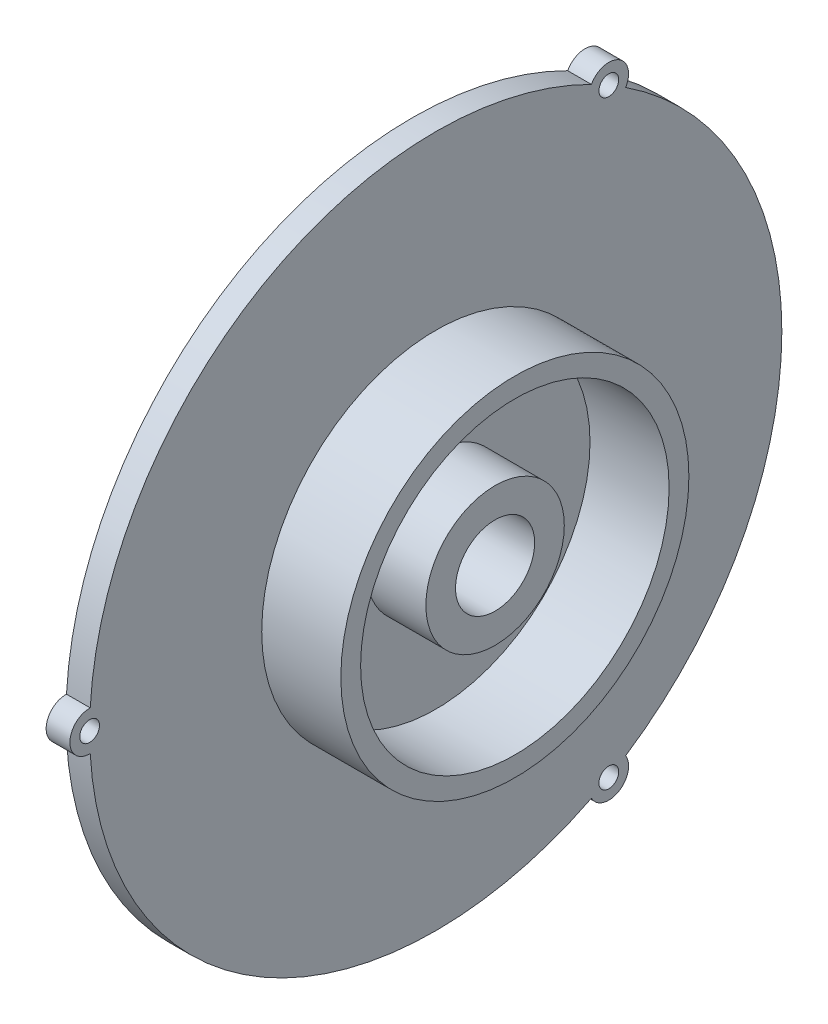
ISO-10303-21;
HEADER;
FILE_DESCRIPTION(('STEP AP214'),'2;1');
FILE_NAME('part.step','',(''),(''),'','','');
FILE_SCHEMA(('AUTOMOTIVE_DESIGN { 1 0 10303 214 1 1 1 1 }'));
ENDSEC;
DATA;
#1=APPLICATION_CONTEXT('core data for automotive mechanical design processes');
#2=APPLICATION_PROTOCOL_DEFINITION('international standard','automotive_design',2000,#1);
#3=PRODUCT_CONTEXT('',#1,'mechanical');
#4=PRODUCT('Part','Part','',(#3));
#5=PRODUCT_RELATED_PRODUCT_CATEGORY('part','',(#4));
#6=PRODUCT_DEFINITION_FORMATION('','',#4);
#7=PRODUCT_DEFINITION_CONTEXT('part definition',#1,'design');
#8=PRODUCT_DEFINITION('design','',#6,#7);
#9=PRODUCT_DEFINITION_SHAPE('','',#8);
#10=(LENGTH_UNIT() NAMED_UNIT(*) SI_UNIT(.MILLI.,.METRE.));
#11=(NAMED_UNIT(*) PLANE_ANGLE_UNIT() SI_UNIT($,.RADIAN.));
#12=(NAMED_UNIT(*) SI_UNIT($,.STERADIAN.) SOLID_ANGLE_UNIT());
#13=UNCERTAINTY_MEASURE_WITH_UNIT(LENGTH_MEASURE(1.E-05),#10,'distance_accuracy_value','');
#14=(GEOMETRIC_REPRESENTATION_CONTEXT(3) GLOBAL_UNCERTAINTY_ASSIGNED_CONTEXT((#13)) GLOBAL_UNIT_ASSIGNED_CONTEXT((#10,
#11,#12)) REPRESENTATION_CONTEXT('',''));
#15=CARTESIAN_POINT('',(0.,0.,0.));
#16=DIRECTION('',(0.,0.,1.));
#17=DIRECTION('',(1.,0.,0.));
#18=AXIS2_PLACEMENT_3D('',#15,#16,#17);
#19=CARTESIAN_POINT('',(-2.99999999999999,0.,0.));
#20=DIRECTION('',(-1.,0.,0.));
#21=DIRECTION('',(0.,0.,1.));
#22=AXIS2_PLACEMENT_3D('',#19,#20,#21);
#23=PLANE('',#22);
#24=CARTESIAN_POINT('',(-2.99999999999999,0.,0.));
#25=DIRECTION('',(-1.,0.,0.));
#26=DIRECTION('',(0.,0.,1.));
#27=AXIS2_PLACEMENT_3D('',#24,#25,#26);
#28=CIRCLE('',#27,81.5000000000105);
#29=CARTESIAN_POINT('',(-2.99999999999999,0.,81.5000000000105));
#30=VERTEX_POINT('',#29);
#31=EDGE_CURVE('E161',#30,#30,#28,.T.);
#32=ORIENTED_EDGE('',*,*,#31,.T.);
#33=EDGE_LOOP('',(#32));
#34=FACE_BOUND('',#33,.T.);
#35=CARTESIAN_POINT('',(-2.99999999999999,0.,0.));
#36=DIRECTION('',(-1.,0.,0.));
#37=DIRECTION('',(0.,0.,1.));
#38=AXIS2_PLACEMENT_3D('',#35,#36,#37);
#39=CIRCLE('',#38,15.);
#40=CARTESIAN_POINT('',(-2.99999999999999,0.,15.));
#41=VERTEX_POINT('',#40);
#42=EDGE_CURVE('E395',#41,#41,#39,.T.);
#43=ORIENTED_EDGE('',*,*,#42,.F.);
#44=EDGE_LOOP('',(#43));
#45=FACE_BOUND('',#44,.T.);
#46=ADVANCED_FACE('F43',(#34,#45),#23,.T.);
#47=CARTESIAN_POINT('',(-30.,0.,0.));
#48=DIRECTION('',(1.,0.,0.));
#49=DIRECTION('',(0.,0.,-1.));
#50=AXIS2_PLACEMENT_3D('',#47,#48,#49);
#51=CYLINDRICAL_SURFACE('',#50,8.);
#52=CARTESIAN_POINT('',(0.,0.,0.));
#53=DIRECTION('',(1.,0.,0.));
#54=DIRECTION('',(0.,0.,-1.));
#55=AXIS2_PLACEMENT_3D('',#52,#53,#54);
#56=CIRCLE('',#55,8.);
#57=CARTESIAN_POINT('',(0.,0.,-8.));
#58=VERTEX_POINT('',#57);
#59=EDGE_CURVE('E105',#58,#58,#56,.T.);
#60=ORIENTED_EDGE('',*,*,#59,.T.);
#61=EDGE_LOOP('',(#60));
#62=FACE_BOUND('',#61,.T.);
#63=CARTESIAN_POINT('',(-5.99999999999999,0.,0.));
#64=DIRECTION('',(1.,0.,0.));
#65=DIRECTION('',(0.,0.,-1.));
#66=AXIS2_PLACEMENT_3D('',#63,#64,#65);
#67=CIRCLE('',#66,8.);
#68=CARTESIAN_POINT('',(-5.99999999999999,0.,-8.));
#69=VERTEX_POINT('',#68);
#70=EDGE_CURVE('E391',#69,#69,#67,.T.);
#71=ORIENTED_EDGE('',*,*,#70,.F.);
#72=EDGE_LOOP('',(#71));
#73=FACE_BOUND('',#72,.T.);
#74=ADVANCED_FACE('F155',(#62,#73),#51,.F.);
#75=CARTESIAN_POINT('',(0.,0.,0.));
#76=DIRECTION('',(-1.,0.,0.));
#77=DIRECTION('',(0.,0.,1.));
#78=AXIS2_PLACEMENT_3D('',#75,#76,#77);
#79=PLANE('',#78);
#80=CARTESIAN_POINT('',(0.,0.,0.));
#81=DIRECTION('',(-1.,0.,0.));
#82=DIRECTION('',(0.,0.,1.));
#83=AXIS2_PLACEMENT_3D('',#80,#81,#82);
#84=CIRCLE('',#83,17.5);
#85=CARTESIAN_POINT('',(0.,0.,17.5));
#86=VERTEX_POINT('',#85);
#87=EDGE_CURVE('E51',#86,#86,#84,.F.);
#88=ORIENTED_EDGE('',*,*,#87,.F.);
#89=EDGE_LOOP('',(#88));
#90=FACE_BOUND('',#89,.T.);
#91=CARTESIAN_POINT('',(0.,0.,0.));
#92=DIRECTION('',(1.,0.,0.));
#93=DIRECTION('',(0.,0.,-1.));
#94=AXIS2_PLACEMENT_3D('',#91,#92,#93);
#95=CIRCLE('',#94,39.);
#96=CARTESIAN_POINT('',(0.,0.,-39.));
#97=VERTEX_POINT('',#96);
#98=EDGE_CURVE('E158',#97,#97,#95,.T.);
#99=ORIENTED_EDGE('',*,*,#98,.T.);
#100=EDGE_LOOP('',(#99));
#101=FACE_BOUND('',#100,.T.);
#102=ADVANCED_FACE('F151',(#90,#101),#79,.F.);
#103=ORIENTED_EDGE('',*,*,#59,.F.);
#104=EDGE_LOOP('',(#103));
#105=FACE_BOUND('',#104,.T.);
#106=CARTESIAN_POINT('',(0.,0.,0.));
#107=DIRECTION('',(1.,0.,0.));
#108=DIRECTION('',(0.,0.,-1.));
#109=AXIS2_PLACEMENT_3D('',#106,#107,#108);
#110=CIRCLE('',#109,10.);
#111=CARTESIAN_POINT('',(0.,0.,-10.));
#112=VERTEX_POINT('',#111);
#113=EDGE_CURVE('E173',#112,#112,#110,.T.);
#114=ORIENTED_EDGE('',*,*,#113,.T.);
#115=EDGE_LOOP('',(#114));
#116=FACE_BOUND('',#115,.T.);
#117=ADVANCED_FACE('F154',(#105,#116),#79,.F.);
#118=CARTESIAN_POINT('',(38.110918510453,0.,0.));
#119=DIRECTION('',(1.,0.,0.));
#120=DIRECTION('',(0.,0.,-1.));
#121=AXIS2_PLACEMENT_3D('',#118,#119,#120);
#122=CYLINDRICAL_SURFACE('',#121,87.5);
#123=CARTESIAN_POINT('',(0.,0.,0.));
#124=DIRECTION('',(1.,0.,0.));
#125=DIRECTION('',(0.,0.,-1.));
#126=AXIS2_PLACEMENT_3D('',#123,#124,#125);
#127=CIRCLE('',#126,87.5);
#128=CARTESIAN_POINT('',(0.,-73.1545255328067,-48.0069306878698));
#129=VERTEX_POINT('',#128);
#130=CARTESIAN_POINT('',(0.,73.1545255328073,-48.0069306878688));
#131=VERTEX_POINT('',#130);
#132=EDGE_CURVE('E145',#129,#131,#127,.T.);
#133=ORIENTED_EDGE('',*,*,#132,.F.);
#134=DIRECTION('',(-1.,0.,0.));
#135=VECTOR('',#134,1.);
#136=CARTESIAN_POINT('',(-2.99999999999999,-73.1545255328067,-48.0069306878698));
#137=LINE('',#136,#135);
#138=CARTESIAN_POINT('',(-5.99999999999999,-73.1545255328067,-48.0069306878698));
#139=VERTEX_POINT('',#138);
#140=EDGE_CURVE('E129',#129,#139,#137,.T.);
#141=ORIENTED_EDGE('',*,*,#140,.T.);
#142=CARTESIAN_POINT('',(-5.99999999999999,0.,0.));
#143=DIRECTION('',(1.,0.,0.));
#144=DIRECTION('',(0.,0.,-1.));
#145=AXIS2_PLACEMENT_3D('',#142,#143,#144);
#146=CIRCLE('',#145,87.5);
#147=CARTESIAN_POINT('',(-5.99999999999999,73.1545255328074,-48.0069306878687));
#148=VERTEX_POINT('',#147);
#149=EDGE_CURVE('E104',#139,#148,#146,.T.);
#150=ORIENTED_EDGE('',*,*,#149,.T.);
#151=DIRECTION('',(-1.,0.,0.));
#152=VECTOR('',#151,1.);
#153=CARTESIAN_POINT('',(-2.99999999999999,73.1545255328073,-48.0069306878688));
#154=LINE('',#153,#152);
#155=EDGE_CURVE('E66',#148,#131,#154,.F.);
#156=ORIENTED_EDGE('',*,*,#155,.T.);
#157=EDGE_LOOP('',(#133,#141,#150,#156));
#158=FACE_BOUND('',#157,.T.);
#159=ADVANCED_FACE('F302',(#158),#122,.T.);
#160=CARTESIAN_POINT('',(0.,78.1524842998175,-39.3502121692727));
#161=VERTEX_POINT('',#160);
#162=CARTESIAN_POINT('',(0.,4.99795876701026,87.3571428571429));
#163=VERTEX_POINT('',#162);
#164=EDGE_CURVE('E58',#161,#163,#127,.T.);
#165=ORIENTED_EDGE('',*,*,#164,.F.);
#166=DIRECTION('',(-1.,0.,0.));
#167=VECTOR('',#166,1.);
#168=CARTESIAN_POINT('',(-2.99999999999999,78.1524842998175,-39.3502121692727));
#169=LINE('',#168,#167);
#170=CARTESIAN_POINT('',(-5.99999999999999,78.1524842998175,-39.3502121692727));
#171=VERTEX_POINT('',#170);
#172=EDGE_CURVE('E108',#161,#171,#169,.T.);
#173=ORIENTED_EDGE('',*,*,#172,.T.);
#174=CARTESIAN_POINT('',(-5.99999999999999,4.99795876701016,87.3571428571429));
#175=VERTEX_POINT('',#174);
#176=EDGE_CURVE('E97',#171,#175,#146,.T.);
#177=ORIENTED_EDGE('',*,*,#176,.T.);
#178=DIRECTION('',(-1.,0.,0.));
#179=VECTOR('',#178,1.);
#180=CARTESIAN_POINT('',(-2.99999999999999,4.99795876701026,87.3571428571429));
#181=LINE('',#180,#179);
#182=EDGE_CURVE('E135',#175,#163,#181,.F.);
#183=ORIENTED_EDGE('',*,*,#182,.T.);
#184=EDGE_LOOP('',(#165,#173,#177,#183));
#185=FACE_BOUND('',#184,.T.);
#186=ADVANCED_FACE('F109',(#185),#122,.T.);
#187=CARTESIAN_POINT('',(0.,0.,0.));
#188=DIRECTION('',(-1.,0.,0.));
#189=DIRECTION('',(0.,0.,1.));
#190=AXIS2_PLACEMENT_3D('',#187,#188,#189);
#191=CIRCLE('',#190,44.);
#192=CARTESIAN_POINT('',(0.,0.,44.));
#193=VERTEX_POINT('',#192);
#194=EDGE_CURVE('E11',#193,#193,#191,.F.);
#195=ORIENTED_EDGE('',*,*,#194,.F.);
#196=EDGE_LOOP('',(#195));
#197=FACE_BOUND('',#196,.T.);
#198=CARTESIAN_POINT('',(0.,-75.7772228311382,-43.7500000000004));
#199=DIRECTION('',(-1.,0.,0.));
#200=DIRECTION('',(0.,-0.866025403784436,-0.500000000000004));
#201=AXIS2_PLACEMENT_3D('',#198,#199,#200);
#202=CIRCLE('',#201,2.5);
#203=CARTESIAN_POINT('',(0.,-77.9422863405993,-45.0000000000004));
#204=VERTEX_POINT('',#203);
#205=EDGE_CURVE('E183',#204,#204,#202,.T.);
#206=ORIENTED_EDGE('',*,*,#205,.T.);
#207=EDGE_LOOP('',(#206));
#208=FACE_BOUND('',#207,.T.);
#209=CARTESIAN_POINT('',(0.,75.7772228311388,-43.7499999999993));
#210=DIRECTION('',(-1.,0.,0.));
#211=DIRECTION('',(0.,0.866025403784443,-0.499999999999992));
#212=AXIS2_PLACEMENT_3D('',#209,#210,#211);
#213=CIRCLE('',#212,2.5);
#214=CARTESIAN_POINT('',(0.,77.9422863405999,-44.9999999999993));
#215=VERTEX_POINT('',#214);
#216=EDGE_CURVE('E189',#215,#215,#213,.T.);
#217=ORIENTED_EDGE('',*,*,#216,.T.);
#218=EDGE_LOOP('',(#217));
#219=FACE_BOUND('',#218,.T.);
#220=CARTESIAN_POINT('',(0.,0.,87.5));
#221=DIRECTION('',(-1.,0.,0.));
#222=DIRECTION('',(0.,0.,1.));
#223=AXIS2_PLACEMENT_3D('',#220,#221,#222);
#224=CIRCLE('',#223,2.5);
#225=CARTESIAN_POINT('',(0.,0.,90.));
#226=VERTEX_POINT('',#225);
#227=EDGE_CURVE('E117',#226,#226,#224,.T.);
#228=ORIENTED_EDGE('',*,*,#227,.T.);
#229=EDGE_LOOP('',(#228));
#230=FACE_BOUND('',#229,.T.);
#231=CARTESIAN_POINT('',(0.,-4.99795876701026,87.3571428571429));
#232=VERTEX_POINT('',#231);
#233=CARTESIAN_POINT('',(0.,-78.152484299817,-39.3502121692738));
#234=VERTEX_POINT('',#233);
#235=EDGE_CURVE('E143',#232,#234,#127,.T.);
#236=ORIENTED_EDGE('',*,*,#235,.T.);
#237=CARTESIAN_POINT('',(0.,-75.7772228311382,-43.7500000000004));
#238=DIRECTION('',(-1.,0.,0.));
#239=DIRECTION('',(0.,-0.866025403784436,-0.500000000000004));
#240=AXIS2_PLACEMENT_3D('',#237,#238,#239);
#241=CIRCLE('',#240,5.);
#242=EDGE_CURVE('E126',#129,#234,#241,.T.);
#243=ORIENTED_EDGE('',*,*,#242,.F.);
#244=ORIENTED_EDGE('',*,*,#132,.T.);
#245=CARTESIAN_POINT('',(0.,75.7772228311388,-43.7499999999993));
#246=DIRECTION('',(-1.,0.,0.));
#247=DIRECTION('',(0.,0.866025403784443,-0.499999999999992));
#248=AXIS2_PLACEMENT_3D('',#245,#246,#247);
#249=CIRCLE('',#248,5.);
#250=EDGE_CURVE('E116',#161,#131,#249,.T.);
#251=ORIENTED_EDGE('',*,*,#250,.F.);
#252=ORIENTED_EDGE('',*,*,#164,.T.);
#253=CARTESIAN_POINT('',(0.,0.,87.5));
#254=DIRECTION('',(-1.,0.,0.));
#255=DIRECTION('',(0.,0.,1.));
#256=AXIS2_PLACEMENT_3D('',#253,#254,#255);
#257=CIRCLE('',#256,5.);
#258=EDGE_CURVE('E132',#232,#163,#257,.T.);
#259=ORIENTED_EDGE('',*,*,#258,.F.);
#260=EDGE_LOOP('',(#236,#243,#244,#251,#252,#259));
#261=FACE_BOUND('',#260,.T.);
#262=ADVANCED_FACE('F45',(#197,#208,#219,#230,#261),#79,.F.);
#263=CARTESIAN_POINT('',(-5.99999999999999,-4.99795876701026,87.3571428571429));
#264=VERTEX_POINT('',#263);
#265=CARTESIAN_POINT('',(-5.99999999999999,-78.1524842998169,-39.3502121692738));
#266=VERTEX_POINT('',#265);
#267=EDGE_CURVE('E107',#264,#266,#146,.T.);
#268=ORIENTED_EDGE('',*,*,#267,.T.);
#269=DIRECTION('',(-1.,0.,0.));
#270=VECTOR('',#269,1.);
#271=CARTESIAN_POINT('',(-2.99999999999999,-78.152484299817,-39.3502121692738));
#272=LINE('',#271,#270);
#273=EDGE_CURVE('E113',#266,#234,#272,.F.);
#274=ORIENTED_EDGE('',*,*,#273,.T.);
#275=ORIENTED_EDGE('',*,*,#235,.F.);
#276=DIRECTION('',(-1.,0.,0.));
#277=VECTOR('',#276,1.);
#278=CARTESIAN_POINT('',(-2.99999999999999,-4.99795876701026,87.3571428571429));
#279=LINE('',#278,#277);
#280=EDGE_CURVE('E138',#232,#264,#279,.T.);
#281=ORIENTED_EDGE('',*,*,#280,.T.);
#282=EDGE_LOOP('',(#268,#274,#275,#281));
#283=FACE_BOUND('',#282,.T.);
#284=ADVANCED_FACE('F205',(#283),#122,.T.);
#285=CARTESIAN_POINT('',(-5.99999999999999,0.,87.5));
#286=DIRECTION('',(1.,0.,0.));
#287=DIRECTION('',(0.,0.,-1.));
#288=AXIS2_PLACEMENT_3D('',#285,#286,#287);
#289=PLANE('',#288);
#290=CARTESIAN_POINT('',(-5.99999999999999,0.,0.));
#291=DIRECTION('',(-1.,0.,0.));
#292=DIRECTION('',(0.,0.,1.));
#293=AXIS2_PLACEMENT_3D('',#290,#291,#292);
#294=CIRCLE('',#293,81.5000000000105);
#295=CARTESIAN_POINT('',(-5.99999999999999,0.,81.5000000000105));
#296=VERTEX_POINT('',#295);
#297=EDGE_CURVE('E167',#296,#296,#294,.T.);
#298=ORIENTED_EDGE('',*,*,#297,.F.);
#299=EDGE_LOOP('',(#298));
#300=FACE_BOUND('',#299,.T.);
#301=CARTESIAN_POINT('',(-5.99999999999999,-75.7772228311382,-43.7500000000004));
#302=DIRECTION('',(-1.,0.,0.));
#303=DIRECTION('',(0.,-0.866025403784436,-0.500000000000004));
#304=AXIS2_PLACEMENT_3D('',#301,#302,#303);
#305=CIRCLE('',#304,2.5);
#306=CARTESIAN_POINT('',(-5.99999999999999,-77.9422863405993,-45.0000000000004));
#307=VERTEX_POINT('',#306);
#308=EDGE_CURVE('E186',#307,#307,#305,.T.);
#309=ORIENTED_EDGE('',*,*,#308,.F.);
#310=EDGE_LOOP('',(#309));
#311=FACE_BOUND('',#310,.T.);
#312=CARTESIAN_POINT('',(-5.99999999999999,75.7772228311388,-43.7499999999993));
#313=DIRECTION('',(-1.,0.,0.));
#314=DIRECTION('',(0.,0.866025403784443,-0.499999999999992));
#315=AXIS2_PLACEMENT_3D('',#312,#313,#314);
#316=CIRCLE('',#315,2.5);
#317=CARTESIAN_POINT('',(-5.99999999999999,77.9422863405999,-44.9999999999993));
#318=VERTEX_POINT('',#317);
#319=EDGE_CURVE('E182',#318,#318,#316,.T.);
#320=ORIENTED_EDGE('',*,*,#319,.F.);
#321=EDGE_LOOP('',(#320));
#322=FACE_BOUND('',#321,.T.);
#323=CARTESIAN_POINT('',(-5.99999999999999,0.,87.5));
#324=DIRECTION('',(-1.,0.,0.));
#325=DIRECTION('',(0.,0.,1.));
#326=AXIS2_PLACEMENT_3D('',#323,#324,#325);
#327=CIRCLE('',#326,2.5);
#328=CARTESIAN_POINT('',(-5.99999999999999,0.,90.));
#329=VERTEX_POINT('',#328);
#330=EDGE_CURVE('E122',#329,#329,#327,.T.);
#331=ORIENTED_EDGE('',*,*,#330,.F.);
#332=EDGE_LOOP('',(#331));
#333=FACE_BOUND('',#332,.T.);
#334=ORIENTED_EDGE('',*,*,#149,.F.);
#335=CARTESIAN_POINT('',(-5.99999999999999,-75.7772228311382,-43.7500000000004));
#336=DIRECTION('',(-1.,0.,0.));
#337=DIRECTION('',(0.,-0.866025403784436,-0.500000000000004));
#338=AXIS2_PLACEMENT_3D('',#335,#336,#337);
#339=CIRCLE('',#338,5.);
#340=EDGE_CURVE('E119',#139,#266,#339,.T.);
#341=ORIENTED_EDGE('',*,*,#340,.T.);
#342=ORIENTED_EDGE('',*,*,#267,.F.);
#343=CARTESIAN_POINT('',(-5.99999999999999,0.,87.5));
#344=DIRECTION('',(-1.,0.,0.));
#345=DIRECTION('',(0.,0.,1.));
#346=AXIS2_PLACEMENT_3D('',#343,#344,#345);
#347=CIRCLE('',#346,5.);
#348=EDGE_CURVE('E102',#264,#175,#347,.T.);
#349=ORIENTED_EDGE('',*,*,#348,.T.);
#350=ORIENTED_EDGE('',*,*,#176,.F.);
#351=CARTESIAN_POINT('',(-5.99999999999999,75.7772228311388,-43.7499999999993));
#352=DIRECTION('',(-1.,0.,0.));
#353=DIRECTION('',(0.,0.866025403784443,-0.499999999999992));
#354=AXIS2_PLACEMENT_3D('',#351,#352,#353);
#355=CIRCLE('',#354,5.);
#356=EDGE_CURVE('E100',#171,#148,#355,.T.);
#357=ORIENTED_EDGE('',*,*,#356,.T.);
#358=EDGE_LOOP('',(#334,#341,#342,#349,#350,#357));
#359=FACE_BOUND('',#358,.T.);
#360=ADVANCED_FACE('F98',(#300,#311,#322,#333,#359),#289,.F.);
#361=CARTESIAN_POINT('',(0.,0.,87.5));
#362=DIRECTION('',(-1.,0.,0.));
#363=DIRECTION('',(0.,0.,1.));
#364=AXIS2_PLACEMENT_3D('',#361,#362,#363);
#365=CYLINDRICAL_SURFACE('',#364,5.);
#366=ORIENTED_EDGE('',*,*,#280,.F.);
#367=ORIENTED_EDGE('',*,*,#258,.T.);
#368=ORIENTED_EDGE('',*,*,#182,.F.);
#369=ORIENTED_EDGE('',*,*,#348,.F.);
#370=EDGE_LOOP('',(#366,#367,#368,#369));
#371=FACE_BOUND('',#370,.T.);
#372=ADVANCED_FACE('F210',(#371),#365,.T.);
#373=CARTESIAN_POINT('',(0.,75.7772228311388,-43.7499999999993));
#374=DIRECTION('',(-1.,0.,0.));
#375=DIRECTION('',(0.,0.,1.));
#376=AXIS2_PLACEMENT_3D('',#373,#374,#375);
#377=CYLINDRICAL_SURFACE('',#376,5.);
#378=ORIENTED_EDGE('',*,*,#172,.F.);
#379=ORIENTED_EDGE('',*,*,#250,.T.);
#380=ORIENTED_EDGE('',*,*,#155,.F.);
#381=ORIENTED_EDGE('',*,*,#356,.F.);
#382=EDGE_LOOP('',(#378,#379,#380,#381));
#383=FACE_BOUND('',#382,.T.);
#384=ADVANCED_FACE('F115',(#383),#377,.T.);
#385=CARTESIAN_POINT('',(0.,-75.7772228311382,-43.7500000000004));
#386=DIRECTION('',(-1.,0.,0.));
#387=DIRECTION('',(0.,0.,1.));
#388=AXIS2_PLACEMENT_3D('',#385,#386,#387);
#389=CYLINDRICAL_SURFACE('',#388,5.);
#390=ORIENTED_EDGE('',*,*,#140,.F.);
#391=ORIENTED_EDGE('',*,*,#242,.T.);
#392=ORIENTED_EDGE('',*,*,#273,.F.);
#393=ORIENTED_EDGE('',*,*,#340,.F.);
#394=EDGE_LOOP('',(#390,#391,#392,#393));
#395=FACE_BOUND('',#394,.T.);
#396=ADVANCED_FACE('F202',(#395),#389,.T.);
#397=CARTESIAN_POINT('',(0.,0.,87.5));
#398=DIRECTION('',(-1.,0.,0.));
#399=DIRECTION('',(0.,0.,1.));
#400=AXIS2_PLACEMENT_3D('',#397,#398,#399);
#401=CYLINDRICAL_SURFACE('',#400,2.5);
#402=ORIENTED_EDGE('',*,*,#227,.F.);
#403=EDGE_LOOP('',(#402));
#404=FACE_BOUND('',#403,.T.);
#405=ORIENTED_EDGE('',*,*,#330,.T.);
#406=EDGE_LOOP('',(#405));
#407=FACE_BOUND('',#406,.T.);
#408=ADVANCED_FACE('F269',(#404,#407),#401,.F.);
#409=CARTESIAN_POINT('',(0.,75.7772228311388,-43.7499999999993));
#410=DIRECTION('',(-1.,0.,0.));
#411=DIRECTION('',(0.,0.,1.));
#412=AXIS2_PLACEMENT_3D('',#409,#410,#411);
#413=CYLINDRICAL_SURFACE('',#412,2.5);
#414=ORIENTED_EDGE('',*,*,#216,.F.);
#415=EDGE_LOOP('',(#414));
#416=FACE_BOUND('',#415,.T.);
#417=ORIENTED_EDGE('',*,*,#319,.T.);
#418=EDGE_LOOP('',(#417));
#419=FACE_BOUND('',#418,.T.);
#420=ADVANCED_FACE('F265',(#416,#419),#413,.F.);
#421=CARTESIAN_POINT('',(0.,-75.7772228311382,-43.7500000000004));
#422=DIRECTION('',(-1.,0.,0.));
#423=DIRECTION('',(0.,0.,1.));
#424=AXIS2_PLACEMENT_3D('',#421,#422,#423);
#425=CYLINDRICAL_SURFACE('',#424,2.5);
#426=ORIENTED_EDGE('',*,*,#205,.F.);
#427=EDGE_LOOP('',(#426));
#428=FACE_BOUND('',#427,.T.);
#429=ORIENTED_EDGE('',*,*,#308,.T.);
#430=EDGE_LOOP('',(#429));
#431=FACE_BOUND('',#430,.T.);
#432=ADVANCED_FACE('F258',(#428,#431),#425,.F.);
#433=CARTESIAN_POINT('',(15.,0.,0.));
#434=DIRECTION('',(1.,0.,0.));
#435=DIRECTION('',(0.,0.,-1.));
#436=AXIS2_PLACEMENT_3D('',#433,#434,#435);
#437=PLANE('',#436);
#438=CARTESIAN_POINT('',(15.,0.,0.));
#439=DIRECTION('',(1.,0.,0.));
#440=DIRECTION('',(0.,0.,-1.));
#441=AXIS2_PLACEMENT_3D('',#438,#439,#440);
#442=CIRCLE('',#441,17.5);
#443=CARTESIAN_POINT('',(15.,0.,-17.5));
#444=VERTEX_POINT('',#443);
#445=EDGE_CURVE('E177',#444,#444,#442,.T.);
#446=ORIENTED_EDGE('',*,*,#445,.T.);
#447=EDGE_LOOP('',(#446));
#448=FACE_BOUND('',#447,.T.);
#449=CARTESIAN_POINT('',(15.,0.,0.));
#450=DIRECTION('',(1.,0.,0.));
#451=DIRECTION('',(0.,0.,-1.));
#452=AXIS2_PLACEMENT_3D('',#449,#450,#451);
#453=CIRCLE('',#452,10.);
#454=CARTESIAN_POINT('',(15.,0.,-10.));
#455=VERTEX_POINT('',#454);
#456=EDGE_CURVE('E174',#455,#455,#453,.T.);
#457=ORIENTED_EDGE('',*,*,#456,.F.);
#458=EDGE_LOOP('',(#457));
#459=FACE_BOUND('',#458,.T.);
#460=ADVANCED_FACE('F255',(#448,#459),#437,.T.);
#461=CARTESIAN_POINT('',(15.,0.,0.));
#462=DIRECTION('',(-1.,0.,0.));
#463=DIRECTION('',(0.,0.,1.));
#464=AXIS2_PLACEMENT_3D('',#461,#462,#463);
#465=CYLINDRICAL_SURFACE('',#464,17.5);
#466=ORIENTED_EDGE('',*,*,#445,.F.);
#467=EDGE_LOOP('',(#466));
#468=FACE_BOUND('',#467,.T.);
#469=ORIENTED_EDGE('',*,*,#87,.T.);
#470=EDGE_LOOP('',(#469));
#471=FACE_BOUND('',#470,.T.);
#472=ADVANCED_FACE('F149',(#468,#471),#465,.T.);
#473=CARTESIAN_POINT('',(15.,0.,0.));
#474=DIRECTION('',(-1.,0.,0.));
#475=DIRECTION('',(0.,0.,1.));
#476=AXIS2_PLACEMENT_3D('',#473,#474,#475);
#477=CYLINDRICAL_SURFACE('',#476,10.);
#478=ORIENTED_EDGE('',*,*,#456,.T.);
#479=EDGE_LOOP('',(#478));
#480=FACE_BOUND('',#479,.T.);
#481=ORIENTED_EDGE('',*,*,#113,.F.);
#482=EDGE_LOOP('',(#481));
#483=FACE_BOUND('',#482,.T.);
#484=ADVANCED_FACE('F247',(#480,#483),#477,.F.);
#485=CARTESIAN_POINT('',(20.,0.,0.));
#486=DIRECTION('',(1.,0.,0.));
#487=DIRECTION('',(0.,0.,-1.));
#488=AXIS2_PLACEMENT_3D('',#485,#486,#487);
#489=PLANE('',#488);
#490=CARTESIAN_POINT('',(20.,0.,0.));
#491=DIRECTION('',(1.,0.,0.));
#492=DIRECTION('',(0.,0.,-1.));
#493=AXIS2_PLACEMENT_3D('',#490,#491,#492);
#494=CIRCLE('',#493,44.);
#495=CARTESIAN_POINT('',(20.,0.,-44.));
#496=VERTEX_POINT('',#495);
#497=EDGE_CURVE('E164',#496,#496,#494,.T.);
#498=ORIENTED_EDGE('',*,*,#497,.T.);
#499=EDGE_LOOP('',(#498));
#500=FACE_BOUND('',#499,.T.);
#501=CARTESIAN_POINT('',(20.,0.,0.));
#502=DIRECTION('',(1.,0.,0.));
#503=DIRECTION('',(0.,0.,-1.));
#504=AXIS2_PLACEMENT_3D('',#501,#502,#503);
#505=CIRCLE('',#504,39.);
#506=CARTESIAN_POINT('',(20.,0.,-39.));
#507=VERTEX_POINT('',#506);
#508=EDGE_CURVE('E160',#507,#507,#505,.T.);
#509=ORIENTED_EDGE('',*,*,#508,.F.);
#510=EDGE_LOOP('',(#509));
#511=FACE_BOUND('',#510,.T.);
#512=ADVANCED_FACE('F244',(#500,#511),#489,.T.);
#513=CARTESIAN_POINT('',(20.,0.,0.));
#514=DIRECTION('',(-1.,0.,0.));
#515=DIRECTION('',(0.,0.,1.));
#516=AXIS2_PLACEMENT_3D('',#513,#514,#515);
#517=CYLINDRICAL_SURFACE('',#516,44.);
#518=ORIENTED_EDGE('',*,*,#497,.F.);
#519=EDGE_LOOP('',(#518));
#520=FACE_BOUND('',#519,.T.);
#521=ORIENTED_EDGE('',*,*,#194,.T.);
#522=EDGE_LOOP('',(#521));
#523=FACE_BOUND('',#522,.T.);
#524=ADVANCED_FACE('F242',(#520,#523),#517,.T.);
#525=CARTESIAN_POINT('',(20.,0.,0.));
#526=DIRECTION('',(-1.,0.,0.));
#527=DIRECTION('',(0.,0.,1.));
#528=AXIS2_PLACEMENT_3D('',#525,#526,#527);
#529=CYLINDRICAL_SURFACE('',#528,39.);
#530=ORIENTED_EDGE('',*,*,#508,.T.);
#531=EDGE_LOOP('',(#530));
#532=FACE_BOUND('',#531,.T.);
#533=ORIENTED_EDGE('',*,*,#98,.F.);
#534=EDGE_LOOP('',(#533));
#535=FACE_BOUND('',#534,.T.);
#536=ADVANCED_FACE('F238',(#532,#535),#529,.F.);
#537=CARTESIAN_POINT('',(-2.99999999999999,0.,0.));
#538=DIRECTION('',(-1.,0.,0.));
#539=DIRECTION('',(0.,0.,1.));
#540=AXIS2_PLACEMENT_3D('',#537,#538,#539);
#541=CYLINDRICAL_SURFACE('',#540,81.5000000000105);
#542=ORIENTED_EDGE('',*,*,#31,.F.);
#543=EDGE_LOOP('',(#542));
#544=FACE_BOUND('',#543,.T.);
#545=ORIENTED_EDGE('',*,*,#297,.T.);
#546=EDGE_LOOP('',(#545));
#547=FACE_BOUND('',#546,.T.);
#548=ADVANCED_FACE('F235',(#544,#547),#541,.F.);
#549=CARTESIAN_POINT('',(-48.4264068711929,0.,0.));
#550=DIRECTION('',(1.,0.,0.));
#551=DIRECTION('',(0.,0.,-1.));
#552=AXIS2_PLACEMENT_3D('',#549,#550,#551);
#553=CYLINDRICAL_SURFACE('',#552,15.);
#554=CARTESIAN_POINT('',(-5.99999999999999,0.,0.));
#555=DIRECTION('',(1.,0.,0.));
#556=DIRECTION('',(0.,0.,-1.));
#557=AXIS2_PLACEMENT_3D('',#554,#555,#556);
#558=CIRCLE('',#557,15.);
#559=CARTESIAN_POINT('',(-5.99999999999999,0.,-15.));
#560=VERTEX_POINT('',#559);
#561=EDGE_CURVE('E394',#560,#560,#558,.T.);
#562=ORIENTED_EDGE('',*,*,#561,.T.);
#563=EDGE_LOOP('',(#562));
#564=FACE_BOUND('',#563,.T.);
#565=ORIENTED_EDGE('',*,*,#42,.T.);
#566=EDGE_LOOP('',(#565));
#567=FACE_BOUND('',#566,.T.);
#568=ADVANCED_FACE('F237',(#564,#567),#553,.T.);
#569=CARTESIAN_POINT('',(-5.99999999999999,0.,87.5));
#570=DIRECTION('',(1.,0.,0.));
#571=DIRECTION('',(0.,0.,-1.));
#572=AXIS2_PLACEMENT_3D('',#569,#570,#571);
#573=PLANE('',#572);
#574=ORIENTED_EDGE('',*,*,#70,.T.);
#575=EDGE_LOOP('',(#574));
#576=FACE_BOUND('',#575,.T.);
#577=ORIENTED_EDGE('',*,*,#561,.F.);
#578=EDGE_LOOP('',(#577));
#579=FACE_BOUND('',#578,.T.);
#580=ADVANCED_FACE('F233',(#576,#579),#573,.F.);
#581=CLOSED_SHELL('',(#46,#74,#102,#117,#159,#186,#262,#284,#360,#372,#384,#396,#408,#420,#432,
#460,#472,#484,#512,#524,#536,#548,#568,#580));
#582=MANIFOLD_SOLID_BREP('B2',#581);
#583=ADVANCED_BREP_SHAPE_REPRESENTATION('',(#18,#582),#14);
#584=SHAPE_DEFINITION_REPRESENTATION(#9,#583);
ENDSEC;
END-ISO-10303-21;
